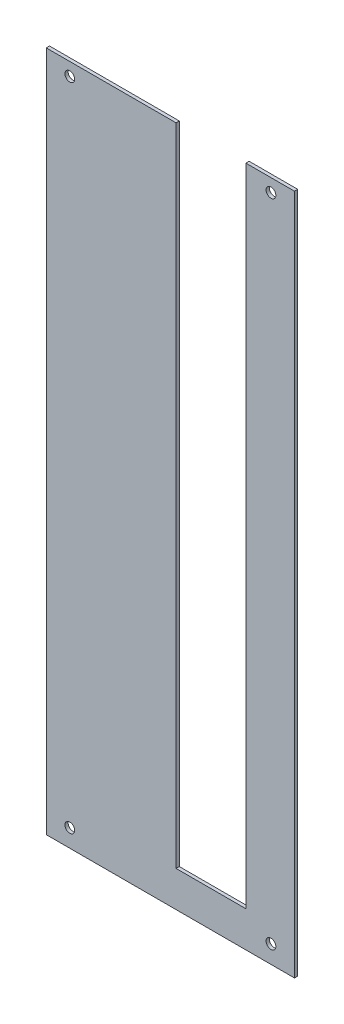
ISO-10303-21;
HEADER;
FILE_DESCRIPTION(('STEP AP214'),'2;1');
FILE_NAME('part.step','',(''),(''),'','','');
FILE_SCHEMA(('AUTOMOTIVE_DESIGN { 1 0 10303 214 1 1 1 1 }'));
ENDSEC;
DATA;
#1=APPLICATION_CONTEXT('core data for automotive mechanical design processes');
#2=APPLICATION_PROTOCOL_DEFINITION('international standard','automotive_design',2000,#1);
#3=PRODUCT_CONTEXT('',#1,'mechanical');
#4=PRODUCT('Part','Part','',(#3));
#5=PRODUCT_RELATED_PRODUCT_CATEGORY('part','',(#4));
#6=PRODUCT_DEFINITION_FORMATION('','',#4);
#7=PRODUCT_DEFINITION_CONTEXT('part definition',#1,'design');
#8=PRODUCT_DEFINITION('design','',#6,#7);
#9=PRODUCT_DEFINITION_SHAPE('','',#8);
#10=(LENGTH_UNIT() NAMED_UNIT(*) SI_UNIT(.MILLI.,.METRE.));
#11=(NAMED_UNIT(*) PLANE_ANGLE_UNIT() SI_UNIT($,.RADIAN.));
#12=(NAMED_UNIT(*) SI_UNIT($,.STERADIAN.) SOLID_ANGLE_UNIT());
#13=UNCERTAINTY_MEASURE_WITH_UNIT(LENGTH_MEASURE(1.E-05),#10,'distance_accuracy_value','');
#14=(GEOMETRIC_REPRESENTATION_CONTEXT(3) GLOBAL_UNCERTAINTY_ASSIGNED_CONTEXT((#13)) GLOBAL_UNIT_ASSIGNED_CONTEXT((#10,
#11,#12)) REPRESENTATION_CONTEXT('',''));
#15=CARTESIAN_POINT('',(0.,0.,0.));
#16=DIRECTION('',(0.,0.,1.));
#17=DIRECTION('',(1.,0.,0.));
#18=AXIS2_PLACEMENT_3D('',#15,#16,#17);
#19=CARTESIAN_POINT('',(-76.5,210.,2.));
#20=DIRECTION('',(0.,-1.,0.));
#21=DIRECTION('',(0.,0.,-1.));
#22=AXIS2_PLACEMENT_3D('',#19,#20,#21);
#23=PLANE('',#22);
#24=DIRECTION('',(-1.,0.,0.));
#25=VECTOR('',#24,1.);
#26=CARTESIAN_POINT('',(-76.5,210.,2.));
#27=LINE('',#26,#25);
#28=CARTESIAN_POINT('',(3.49999999999999,210.,2.));
#29=VERTEX_POINT('',#28);
#30=CARTESIAN_POINT('',(-76.5,210.,2.));
#31=VERTEX_POINT('',#30);
#32=EDGE_CURVE('E125',#29,#31,#27,.T.);
#33=ORIENTED_EDGE('',*,*,#32,.F.);
#34=DIRECTION('',(0.,0.,-1.));
#35=VECTOR('',#34,1.);
#36=CARTESIAN_POINT('',(3.49999999999999,210.,2.001));
#37=LINE('',#36,#35);
#38=CARTESIAN_POINT('',(3.49999999999999,210.,0.));
#39=VERTEX_POINT('',#38);
#40=EDGE_CURVE('E113',#29,#39,#37,.T.);
#41=ORIENTED_EDGE('',*,*,#40,.T.);
#42=DIRECTION('',(-1.,0.,0.));
#43=VECTOR('',#42,1.);
#44=CARTESIAN_POINT('',(-76.5,210.,0.));
#45=LINE('',#44,#43);
#46=CARTESIAN_POINT('',(-76.5,210.,0.));
#47=VERTEX_POINT('',#46);
#48=EDGE_CURVE('E134',#39,#47,#45,.T.);
#49=ORIENTED_EDGE('',*,*,#48,.T.);
#50=DIRECTION('',(0.,0.,-1.));
#51=VECTOR('',#50,1.);
#52=CARTESIAN_POINT('',(-76.5,210.,2.));
#53=LINE('',#52,#51);
#54=EDGE_CURVE('E42',#31,#47,#53,.T.);
#55=ORIENTED_EDGE('',*,*,#54,.F.);
#56=EDGE_LOOP('',(#33,#41,#49,#55));
#57=FACE_BOUND('',#56,.T.);
#58=ADVANCED_FACE('F34',(#57),#23,.F.);
#59=CARTESIAN_POINT('',(76.5,-210.,2.));
#60=DIRECTION('',(-1.,0.,0.));
#61=DIRECTION('',(0.,0.,1.));
#62=AXIS2_PLACEMENT_3D('',#59,#60,#61);
#63=PLANE('',#62);
#64=DIRECTION('',(0.,1.,0.));
#65=VECTOR('',#64,1.);
#66=CARTESIAN_POINT('',(76.5,-210.,0.));
#67=LINE('',#66,#65);
#68=CARTESIAN_POINT('',(76.5,-210.,0.));
#69=VERTEX_POINT('',#68);
#70=CARTESIAN_POINT('',(76.5,210.,0.));
#71=VERTEX_POINT('',#70);
#72=EDGE_CURVE('E112',#69,#71,#67,.T.);
#73=ORIENTED_EDGE('',*,*,#72,.T.);
#74=DIRECTION('',(0.,0.,-1.));
#75=VECTOR('',#74,1.);
#76=CARTESIAN_POINT('',(76.5,210.,2.));
#77=LINE('',#76,#75);
#78=CARTESIAN_POINT('',(76.5,210.,2.));
#79=VERTEX_POINT('',#78);
#80=EDGE_CURVE('E11',#79,#71,#77,.T.);
#81=ORIENTED_EDGE('',*,*,#80,.F.);
#82=DIRECTION('',(0.,1.,0.));
#83=VECTOR('',#82,1.);
#84=CARTESIAN_POINT('',(76.5,-210.,2.));
#85=LINE('',#84,#83);
#86=CARTESIAN_POINT('',(76.5,-210.,2.));
#87=VERTEX_POINT('',#86);
#88=EDGE_CURVE('E122',#87,#79,#85,.T.);
#89=ORIENTED_EDGE('',*,*,#88,.F.);
#90=DIRECTION('',(0.,0.,-1.));
#91=VECTOR('',#90,1.);
#92=CARTESIAN_POINT('',(76.5,-210.,2.));
#93=LINE('',#92,#91);
#94=EDGE_CURVE('E131',#87,#69,#93,.T.);
#95=ORIENTED_EDGE('',*,*,#94,.T.);
#96=EDGE_LOOP('',(#73,#81,#89,#95));
#97=FACE_BOUND('',#96,.T.);
#98=ADVANCED_FACE('F36',(#97),#63,.F.);
#99=CARTESIAN_POINT('',(46.5,210.,0.));
#100=VERTEX_POINT('',#99);
#101=EDGE_CURVE('E117',#71,#100,#45,.T.);
#102=ORIENTED_EDGE('',*,*,#101,.T.);
#103=DIRECTION('',(0.,0.,-1.));
#104=VECTOR('',#103,1.);
#105=CARTESIAN_POINT('',(46.5,210.,2.001));
#106=LINE('',#105,#104);
#107=CARTESIAN_POINT('',(46.5,210.,2.));
#108=VERTEX_POINT('',#107);
#109=EDGE_CURVE('E49',#108,#100,#106,.T.);
#110=ORIENTED_EDGE('',*,*,#109,.F.);
#111=EDGE_CURVE('E85',#79,#108,#27,.T.);
#112=ORIENTED_EDGE('',*,*,#111,.F.);
#113=ORIENTED_EDGE('',*,*,#80,.T.);
#114=EDGE_LOOP('',(#102,#110,#112,#113));
#115=FACE_BOUND('',#114,.T.);
#116=ADVANCED_FACE('F116',(#115),#23,.F.);
#117=CARTESIAN_POINT('',(-76.5,-210.,2.));
#118=DIRECTION('',(1.,0.,0.));
#119=DIRECTION('',(0.,0.,-1.));
#120=AXIS2_PLACEMENT_3D('',#117,#118,#119);
#121=PLANE('',#120);
#122=DIRECTION('',(0.,-1.,0.));
#123=VECTOR('',#122,1.);
#124=CARTESIAN_POINT('',(-76.5,-210.,0.));
#125=LINE('',#124,#123);
#126=CARTESIAN_POINT('',(-76.5,-210.,0.));
#127=VERTEX_POINT('',#126);
#128=EDGE_CURVE('E136',#47,#127,#125,.T.);
#129=ORIENTED_EDGE('',*,*,#128,.T.);
#130=DIRECTION('',(0.,0.,-1.));
#131=VECTOR('',#130,1.);
#132=CARTESIAN_POINT('',(-76.5,-210.,2.));
#133=LINE('',#132,#131);
#134=CARTESIAN_POINT('',(-76.5,-210.,2.));
#135=VERTEX_POINT('',#134);
#136=EDGE_CURVE('E140',#135,#127,#133,.T.);
#137=ORIENTED_EDGE('',*,*,#136,.F.);
#138=DIRECTION('',(0.,-1.,0.));
#139=VECTOR('',#138,1.);
#140=CARTESIAN_POINT('',(-76.5,-210.,2.));
#141=LINE('',#140,#139);
#142=EDGE_CURVE('E124',#31,#135,#141,.T.);
#143=ORIENTED_EDGE('',*,*,#142,.F.);
#144=ORIENTED_EDGE('',*,*,#54,.T.);
#145=EDGE_LOOP('',(#129,#137,#143,#144));
#146=FACE_BOUND('',#145,.T.);
#147=ADVANCED_FACE('F146',(#146),#121,.F.);
#148=CARTESIAN_POINT('',(-76.5,-210.,2.));
#149=DIRECTION('',(0.,1.,0.));
#150=DIRECTION('',(0.,0.,1.));
#151=AXIS2_PLACEMENT_3D('',#148,#149,#150);
#152=PLANE('',#151);
#153=DIRECTION('',(1.,0.,0.));
#154=VECTOR('',#153,1.);
#155=CARTESIAN_POINT('',(-76.5,-210.,0.));
#156=LINE('',#155,#154);
#157=EDGE_CURVE('E79',#127,#69,#156,.T.);
#158=ORIENTED_EDGE('',*,*,#157,.T.);
#159=ORIENTED_EDGE('',*,*,#94,.F.);
#160=DIRECTION('',(1.,0.,0.));
#161=VECTOR('',#160,1.);
#162=CARTESIAN_POINT('',(-76.5,-210.,2.));
#163=LINE('',#162,#161);
#164=EDGE_CURVE('E58',#135,#87,#163,.T.);
#165=ORIENTED_EDGE('',*,*,#164,.F.);
#166=ORIENTED_EDGE('',*,*,#136,.T.);
#167=EDGE_LOOP('',(#158,#159,#165,#166));
#168=FACE_BOUND('',#167,.T.);
#169=ADVANCED_FACE('F156',(#168),#152,.F.);
#170=CARTESIAN_POINT('',(0.,0.,2.));
#171=DIRECTION('',(0.,0.,-1.));
#172=DIRECTION('',(-1.,0.,0.));
#173=AXIS2_PLACEMENT_3D('',#170,#171,#172);
#174=PLANE('',#173);
#175=CARTESIAN_POINT('',(62.,-199.,2.));
#176=DIRECTION('',(0.,0.,-1.));
#177=DIRECTION('',(-1.,0.,0.));
#178=AXIS2_PLACEMENT_3D('',#175,#176,#177);
#179=CIRCLE('',#178,3.);
#180=CARTESIAN_POINT('',(59.,-199.,2.));
#181=VERTEX_POINT('',#180);
#182=EDGE_CURVE('E292',#181,#181,#179,.F.);
#183=ORIENTED_EDGE('',*,*,#182,.F.);
#184=EDGE_LOOP('',(#183));
#185=FACE_BOUND('',#184,.T.);
#186=CARTESIAN_POINT('',(-61.9999999999999,202.,2.));
#187=DIRECTION('',(0.,0.,-1.));
#188=DIRECTION('',(-1.,0.,0.));
#189=AXIS2_PLACEMENT_3D('',#186,#187,#188);
#190=CIRCLE('',#189,3.00000000000001);
#191=CARTESIAN_POINT('',(-64.9999999999999,202.,2.));
#192=VERTEX_POINT('',#191);
#193=EDGE_CURVE('E300',#192,#192,#190,.F.);
#194=ORIENTED_EDGE('',*,*,#193,.F.);
#195=EDGE_LOOP('',(#194));
#196=FACE_BOUND('',#195,.T.);
#197=CARTESIAN_POINT('',(-62.,-199.,2.));
#198=DIRECTION('',(0.,0.,-1.));
#199=DIRECTION('',(-1.,0.,0.));
#200=AXIS2_PLACEMENT_3D('',#197,#198,#199);
#201=CIRCLE('',#200,3.00000000000001);
#202=CARTESIAN_POINT('',(-65.,-199.,2.));
#203=VERTEX_POINT('',#202);
#204=EDGE_CURVE('E320',#203,#203,#201,.F.);
#205=ORIENTED_EDGE('',*,*,#204,.F.);
#206=EDGE_LOOP('',(#205));
#207=FACE_BOUND('',#206,.T.);
#208=CARTESIAN_POINT('',(62.,202.,2.));
#209=DIRECTION('',(0.,0.,-1.));
#210=DIRECTION('',(-1.,0.,0.));
#211=AXIS2_PLACEMENT_3D('',#208,#209,#210);
#212=CIRCLE('',#211,3.);
#213=CARTESIAN_POINT('',(59.,202.,2.));
#214=VERTEX_POINT('',#213);
#215=EDGE_CURVE('E291',#214,#214,#212,.F.);
#216=ORIENTED_EDGE('',*,*,#215,.F.);
#217=EDGE_LOOP('',(#216));
#218=FACE_BOUND('',#217,.T.);
#219=DIRECTION('',(1.,0.,0.));
#220=VECTOR('',#219,1.);
#221=CARTESIAN_POINT('',(46.4999999999999,-188.,2.));
#222=LINE('',#221,#220);
#223=CARTESIAN_POINT('',(3.49999999999999,-188.,2.));
#224=VERTEX_POINT('',#223);
#225=CARTESIAN_POINT('',(46.4999999999999,-188.,2.));
#226=VERTEX_POINT('',#225);
#227=EDGE_CURVE('E295',#224,#226,#222,.T.);
#228=ORIENTED_EDGE('',*,*,#227,.F.);
#229=DIRECTION('',(0.,-1.,0.));
#230=VECTOR('',#229,1.);
#231=CARTESIAN_POINT('',(3.49999999999999,-188.,2.));
#232=LINE('',#231,#230);
#233=EDGE_CURVE('E304',#29,#224,#232,.T.);
#234=ORIENTED_EDGE('',*,*,#233,.F.);
#235=ORIENTED_EDGE('',*,*,#32,.T.);
#236=ORIENTED_EDGE('',*,*,#142,.T.);
#237=ORIENTED_EDGE('',*,*,#164,.T.);
#238=ORIENTED_EDGE('',*,*,#88,.T.);
#239=ORIENTED_EDGE('',*,*,#111,.T.);
#240=DIRECTION('',(0.,1.,0.));
#241=VECTOR('',#240,1.);
#242=CARTESIAN_POINT('',(46.5,210.,2.));
#243=LINE('',#242,#241);
#244=EDGE_CURVE('E107',#226,#108,#243,.T.);
#245=ORIENTED_EDGE('',*,*,#244,.F.);
#246=EDGE_LOOP('',(#228,#234,#235,#236,#237,#238,#239,#245));
#247=FACE_BOUND('',#246,.T.);
#248=ADVANCED_FACE('F120',(#185,#196,#207,#218,#247),#174,.F.);
#249=CARTESIAN_POINT('',(0.,0.,0.));
#250=DIRECTION('',(0.,0.,-1.));
#251=DIRECTION('',(-1.,0.,0.));
#252=AXIS2_PLACEMENT_3D('',#249,#250,#251);
#253=PLANE('',#252);
#254=CARTESIAN_POINT('',(62.,-199.,0.));
#255=DIRECTION('',(0.,0.,-1.));
#256=DIRECTION('',(-1.,0.,0.));
#257=AXIS2_PLACEMENT_3D('',#254,#255,#256);
#258=CIRCLE('',#257,3.);
#259=CARTESIAN_POINT('',(59.,-199.,0.));
#260=VERTEX_POINT('',#259);
#261=EDGE_CURVE('E279',#260,#260,#258,.T.);
#262=ORIENTED_EDGE('',*,*,#261,.F.);
#263=EDGE_LOOP('',(#262));
#264=FACE_BOUND('',#263,.T.);
#265=CARTESIAN_POINT('',(-61.9999999999999,202.,0.));
#266=DIRECTION('',(0.,0.,-1.));
#267=DIRECTION('',(1.,0.,0.));
#268=AXIS2_PLACEMENT_3D('',#265,#266,#267);
#269=CIRCLE('',#268,3.00000000000001);
#270=CARTESIAN_POINT('',(-58.9999999999999,202.,0.));
#271=VERTEX_POINT('',#270);
#272=EDGE_CURVE('E283',#271,#271,#269,.T.);
#273=ORIENTED_EDGE('',*,*,#272,.F.);
#274=EDGE_LOOP('',(#273));
#275=FACE_BOUND('',#274,.T.);
#276=CARTESIAN_POINT('',(-62.,-199.,0.));
#277=DIRECTION('',(0.,0.,-1.));
#278=DIRECTION('',(1.,0.,0.));
#279=AXIS2_PLACEMENT_3D('',#276,#277,#278);
#280=CIRCLE('',#279,3.00000000000001);
#281=CARTESIAN_POINT('',(-59.,-199.,0.));
#282=VERTEX_POINT('',#281);
#283=EDGE_CURVE('E287',#282,#282,#280,.T.);
#284=ORIENTED_EDGE('',*,*,#283,.F.);
#285=EDGE_LOOP('',(#284));
#286=FACE_BOUND('',#285,.T.);
#287=CARTESIAN_POINT('',(62.,202.,0.));
#288=DIRECTION('',(0.,0.,-1.));
#289=DIRECTION('',(-1.,0.,0.));
#290=AXIS2_PLACEMENT_3D('',#287,#288,#289);
#291=CIRCLE('',#290,3.);
#292=CARTESIAN_POINT('',(59.,202.,0.));
#293=VERTEX_POINT('',#292);
#294=EDGE_CURVE('E290',#293,#293,#291,.T.);
#295=ORIENTED_EDGE('',*,*,#294,.F.);
#296=EDGE_LOOP('',(#295));
#297=FACE_BOUND('',#296,.T.);
#298=DIRECTION('',(0.,1.,0.));
#299=VECTOR('',#298,1.);
#300=CARTESIAN_POINT('',(3.49999999999999,-188.,0.));
#301=LINE('',#300,#299);
#302=CARTESIAN_POINT('',(3.49999999999999,-188.,0.));
#303=VERTEX_POINT('',#302);
#304=EDGE_CURVE('E118',#303,#39,#301,.T.);
#305=ORIENTED_EDGE('',*,*,#304,.F.);
#306=DIRECTION('',(-1.,0.,0.));
#307=VECTOR('',#306,1.);
#308=CARTESIAN_POINT('',(46.4999999999999,-188.,0.));
#309=LINE('',#308,#307);
#310=CARTESIAN_POINT('',(46.4999999999999,-188.,0.));
#311=VERTEX_POINT('',#310);
#312=EDGE_CURVE('E309',#311,#303,#309,.T.);
#313=ORIENTED_EDGE('',*,*,#312,.F.);
#314=DIRECTION('',(0.,-1.,0.));
#315=VECTOR('',#314,1.);
#316=CARTESIAN_POINT('',(46.5,210.,0.));
#317=LINE('',#316,#315);
#318=EDGE_CURVE('E307',#100,#311,#317,.T.);
#319=ORIENTED_EDGE('',*,*,#318,.F.);
#320=ORIENTED_EDGE('',*,*,#101,.F.);
#321=ORIENTED_EDGE('',*,*,#72,.F.);
#322=ORIENTED_EDGE('',*,*,#157,.F.);
#323=ORIENTED_EDGE('',*,*,#128,.F.);
#324=ORIENTED_EDGE('',*,*,#48,.F.);
#325=EDGE_LOOP('',(#305,#313,#319,#320,#321,#322,#323,#324));
#326=FACE_BOUND('',#325,.T.);
#327=ADVANCED_FACE('F153',(#264,#275,#286,#297,#326),#253,.T.);
#328=CARTESIAN_POINT('',(3.49999999999999,-188.,2.001));
#329=DIRECTION('',(-1.,0.,0.));
#330=DIRECTION('',(0.,0.,1.));
#331=AXIS2_PLACEMENT_3D('',#328,#329,#330);
#332=PLANE('',#331);
#333=ORIENTED_EDGE('',*,*,#233,.T.);
#334=DIRECTION('',(0.,0.,-1.));
#335=VECTOR('',#334,1.);
#336=CARTESIAN_POINT('',(3.49999999999999,-188.,2.001));
#337=LINE('',#336,#335);
#338=EDGE_CURVE('E315',#224,#303,#337,.T.);
#339=ORIENTED_EDGE('',*,*,#338,.T.);
#340=ORIENTED_EDGE('',*,*,#304,.T.);
#341=ORIENTED_EDGE('',*,*,#40,.F.);
#342=EDGE_LOOP('',(#333,#339,#340,#341));
#343=FACE_BOUND('',#342,.T.);
#344=ADVANCED_FACE('F201',(#343),#332,.F.);
#345=CARTESIAN_POINT('',(46.4999999999999,-188.,2.001));
#346=DIRECTION('',(0.,-1.,0.));
#347=DIRECTION('',(0.,0.,-1.));
#348=AXIS2_PLACEMENT_3D('',#345,#346,#347);
#349=PLANE('',#348);
#350=ORIENTED_EDGE('',*,*,#227,.T.);
#351=DIRECTION('',(0.,0.,-1.));
#352=VECTOR('',#351,1.);
#353=CARTESIAN_POINT('',(46.4999999999999,-188.,2.001));
#354=LINE('',#353,#352);
#355=EDGE_CURVE('E109',#226,#311,#354,.T.);
#356=ORIENTED_EDGE('',*,*,#355,.T.);
#357=ORIENTED_EDGE('',*,*,#312,.T.);
#358=ORIENTED_EDGE('',*,*,#338,.F.);
#359=EDGE_LOOP('',(#350,#356,#357,#358));
#360=FACE_BOUND('',#359,.T.);
#361=ADVANCED_FACE('F206',(#360),#349,.F.);
#362=CARTESIAN_POINT('',(46.5,210.,2.001));
#363=DIRECTION('',(1.,0.,0.));
#364=DIRECTION('',(0.,1.,0.));
#365=AXIS2_PLACEMENT_3D('',#362,#363,#364);
#366=PLANE('',#365);
#367=ORIENTED_EDGE('',*,*,#244,.T.);
#368=ORIENTED_EDGE('',*,*,#109,.T.);
#369=ORIENTED_EDGE('',*,*,#318,.T.);
#370=ORIENTED_EDGE('',*,*,#355,.F.);
#371=EDGE_LOOP('',(#367,#368,#369,#370));
#372=FACE_BOUND('',#371,.T.);
#373=ADVANCED_FACE('F108',(#372),#366,.F.);
#374=CARTESIAN_POINT('',(62.,202.,2.001));
#375=DIRECTION('',(0.,0.,-1.));
#376=DIRECTION('',(-1.,0.,0.));
#377=AXIS2_PLACEMENT_3D('',#374,#375,#376);
#378=CYLINDRICAL_SURFACE('',#377,3.);
#379=ORIENTED_EDGE('',*,*,#294,.T.);
#380=EDGE_LOOP('',(#379));
#381=FACE_BOUND('',#380,.T.);
#382=ORIENTED_EDGE('',*,*,#215,.T.);
#383=EDGE_LOOP('',(#382));
#384=FACE_BOUND('',#383,.T.);
#385=ADVANCED_FACE('F223',(#381,#384),#378,.F.);
#386=CARTESIAN_POINT('',(-62.,-199.,2.001));
#387=DIRECTION('',(0.,0.,-1.));
#388=DIRECTION('',(-1.,0.,0.));
#389=AXIS2_PLACEMENT_3D('',#386,#387,#388);
#390=CYLINDRICAL_SURFACE('',#389,3.00000000000001);
#391=ORIENTED_EDGE('',*,*,#283,.T.);
#392=EDGE_LOOP('',(#391));
#393=FACE_BOUND('',#392,.T.);
#394=ORIENTED_EDGE('',*,*,#204,.T.);
#395=EDGE_LOOP('',(#394));
#396=FACE_BOUND('',#395,.T.);
#397=ADVANCED_FACE('F232',(#393,#396),#390,.F.);
#398=CARTESIAN_POINT('',(-61.9999999999999,202.,2.001));
#399=DIRECTION('',(0.,0.,-1.));
#400=DIRECTION('',(-1.,0.,0.));
#401=AXIS2_PLACEMENT_3D('',#398,#399,#400);
#402=CYLINDRICAL_SURFACE('',#401,3.00000000000001);
#403=ORIENTED_EDGE('',*,*,#272,.T.);
#404=EDGE_LOOP('',(#403));
#405=FACE_BOUND('',#404,.T.);
#406=ORIENTED_EDGE('',*,*,#193,.T.);
#407=EDGE_LOOP('',(#406));
#408=FACE_BOUND('',#407,.T.);
#409=ADVANCED_FACE('F241',(#405,#408),#402,.F.);
#410=CARTESIAN_POINT('',(62.,-199.,2.001));
#411=DIRECTION('',(0.,0.,-1.));
#412=DIRECTION('',(-1.,0.,0.));
#413=AXIS2_PLACEMENT_3D('',#410,#411,#412);
#414=CYLINDRICAL_SURFACE('',#413,3.);
#415=ORIENTED_EDGE('',*,*,#261,.T.);
#416=EDGE_LOOP('',(#415));
#417=FACE_BOUND('',#416,.T.);
#418=ORIENTED_EDGE('',*,*,#182,.T.);
#419=EDGE_LOOP('',(#418));
#420=FACE_BOUND('',#419,.T.);
#421=ADVANCED_FACE('F250',(#417,#420),#414,.F.);
#422=CLOSED_SHELL('',(#58,#98,#116,#147,#169,#248,#327,#344,#361,#373,#385,#397,#409,#421));
#423=MANIFOLD_SOLID_BREP('B2',#422);
#424=ADVANCED_BREP_SHAPE_REPRESENTATION('',(#18,#423),#14);
#425=SHAPE_DEFINITION_REPRESENTATION(#9,#424);
ENDSEC;
END-ISO-10303-21;
